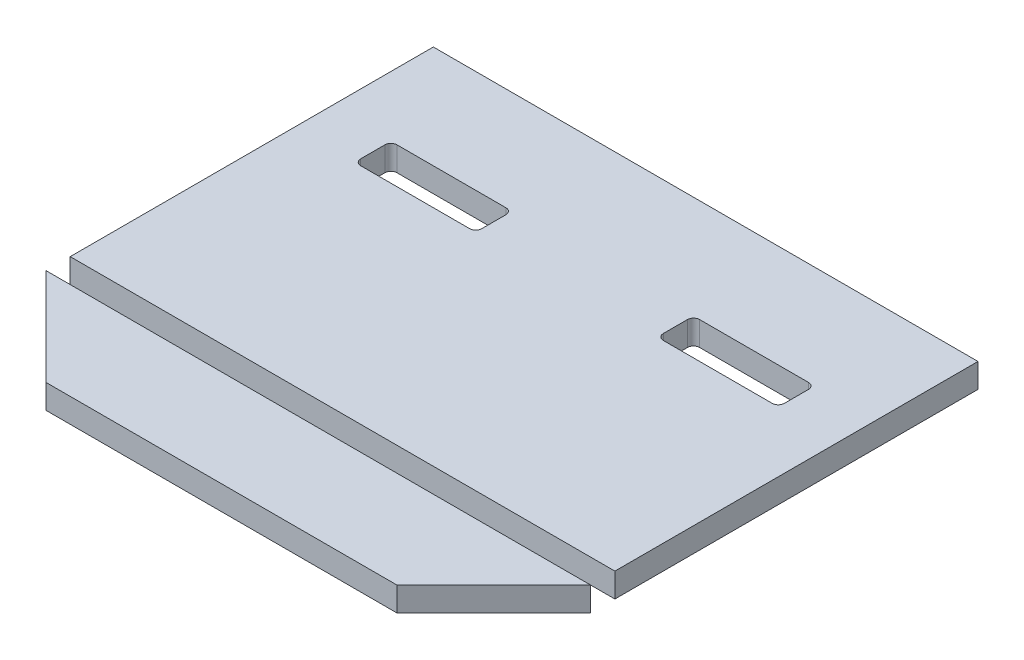
ISO-10303-21;
HEADER;
FILE_DESCRIPTION(('STEP AP214'),'2;1');
FILE_NAME('part.step','',(''),(''),'','','');
FILE_SCHEMA(('AUTOMOTIVE_DESIGN { 1 0 10303 214 1 1 1 1 }'));
ENDSEC;
DATA;
#1=APPLICATION_CONTEXT('core data for automotive mechanical design processes');
#2=APPLICATION_PROTOCOL_DEFINITION('international standard','automotive_design',2000,#1);
#3=PRODUCT_CONTEXT('',#1,'mechanical');
#4=PRODUCT('Part','Part','',(#3));
#5=PRODUCT_RELATED_PRODUCT_CATEGORY('part','',(#4));
#6=PRODUCT_DEFINITION_FORMATION('','',#4);
#7=PRODUCT_DEFINITION_CONTEXT('part definition',#1,'design');
#8=PRODUCT_DEFINITION('design','',#6,#7);
#9=PRODUCT_DEFINITION_SHAPE('','',#8);
#10=(LENGTH_UNIT() NAMED_UNIT(*) SI_UNIT(.MILLI.,.METRE.));
#11=(NAMED_UNIT(*) PLANE_ANGLE_UNIT() SI_UNIT($,.RADIAN.));
#12=(NAMED_UNIT(*) SI_UNIT($,.STERADIAN.) SOLID_ANGLE_UNIT());
#13=UNCERTAINTY_MEASURE_WITH_UNIT(LENGTH_MEASURE(1.E-05),#10,'distance_accuracy_value','');
#14=(GEOMETRIC_REPRESENTATION_CONTEXT(3) GLOBAL_UNCERTAINTY_ASSIGNED_CONTEXT((#13)) GLOBAL_UNIT_ASSIGNED_CONTEXT((#10,
#11,#12)) REPRESENTATION_CONTEXT('',''));
#15=CARTESIAN_POINT('',(0.,0.,0.));
#16=DIRECTION('',(0.,0.,1.));
#17=DIRECTION('',(1.,0.,0.));
#18=AXIS2_PLACEMENT_3D('',#15,#16,#17);
#19=CARTESIAN_POINT('',(19.75,2.,19.75));
#20=DIRECTION('',(0.707106781186548,0.,0.707106781186547));
#21=DIRECTION('',(0.707106781186547,0.,-0.707106781186548));
#22=AXIS2_PLACEMENT_3D('',#19,#20,#21);
#23=PLANE('',#22);
#24=DIRECTION('',(-0.707106781186547,0.,0.707106781186548));
#25=VECTOR('',#24,1.);
#26=CARTESIAN_POINT('',(19.75,0.,19.75));
#27=LINE('',#26,#25);
#28=CARTESIAN_POINT('',(22.5,0.,17.));
#29=VERTEX_POINT('',#28);
#30=CARTESIAN_POINT('',(14.5,0.,25.));
#31=VERTEX_POINT('',#30);
#32=EDGE_CURVE('E112',#29,#31,#27,.T.);
#33=ORIENTED_EDGE('',*,*,#32,.F.);
#34=DIRECTION('',(0.,-1.,0.));
#35=VECTOR('',#34,1.);
#36=CARTESIAN_POINT('',(22.5,2.,17.));
#37=LINE('',#36,#35);
#38=CARTESIAN_POINT('',(22.5,2.,17.));
#39=VERTEX_POINT('',#38);
#40=EDGE_CURVE('E12',#39,#29,#37,.T.);
#41=ORIENTED_EDGE('',*,*,#40,.F.);
#42=DIRECTION('',(-0.707106781186547,0.,0.707106781186548));
#43=VECTOR('',#42,1.);
#44=CARTESIAN_POINT('',(19.75,2.,19.75));
#45=LINE('',#44,#43);
#46=CARTESIAN_POINT('',(14.5,2.,25.));
#47=VERTEX_POINT('',#46);
#48=EDGE_CURVE('E106',#39,#47,#45,.T.);
#49=ORIENTED_EDGE('',*,*,#48,.T.);
#50=DIRECTION('',(0.,-1.,0.));
#51=VECTOR('',#50,1.);
#52=CARTESIAN_POINT('',(14.5,2.,25.));
#53=LINE('',#52,#51);
#54=EDGE_CURVE('E87',#47,#31,#53,.T.);
#55=ORIENTED_EDGE('',*,*,#54,.T.);
#56=EDGE_LOOP('',(#33,#41,#49,#55));
#57=FACE_BOUND('',#56,.T.);
#58=ADVANCED_FACE('F49',(#57),#23,.T.);
#59=CARTESIAN_POINT('',(0.,2.,17.));
#60=DIRECTION('',(0.,0.,-1.));
#61=DIRECTION('',(-1.,0.,0.));
#62=AXIS2_PLACEMENT_3D('',#59,#60,#61);
#63=PLANE('',#62);
#64=DIRECTION('',(1.,0.,0.));
#65=VECTOR('',#64,1.);
#66=CARTESIAN_POINT('',(0.,0.,17.));
#67=LINE('',#66,#65);
#68=CARTESIAN_POINT('',(-22.5,0.,17.));
#69=VERTEX_POINT('',#68);
#70=EDGE_CURVE('E100',#69,#29,#67,.T.);
#71=ORIENTED_EDGE('',*,*,#70,.F.);
#72=DIRECTION('',(0.,-1.,0.));
#73=VECTOR('',#72,1.);
#74=CARTESIAN_POINT('',(-22.5,2.,17.));
#75=LINE('',#74,#73);
#76=CARTESIAN_POINT('',(-22.5,2.,17.));
#77=VERTEX_POINT('',#76);
#78=EDGE_CURVE('E57',#77,#69,#75,.T.);
#79=ORIENTED_EDGE('',*,*,#78,.F.);
#80=DIRECTION('',(1.,0.,0.));
#81=VECTOR('',#80,1.);
#82=CARTESIAN_POINT('',(0.,2.,17.));
#83=LINE('',#82,#81);
#84=EDGE_CURVE('E98',#77,#39,#83,.T.);
#85=ORIENTED_EDGE('',*,*,#84,.T.);
#86=ORIENTED_EDGE('',*,*,#40,.T.);
#87=EDGE_LOOP('',(#71,#79,#85,#86));
#88=FACE_BOUND('',#87,.T.);
#89=ADVANCED_FACE('F96',(#88),#63,.T.);
#90=CARTESIAN_POINT('',(-19.75,2.,19.75));
#91=DIRECTION('',(0.707106781186547,0.,-0.707106781186547));
#92=DIRECTION('',(-0.707106781186548,0.,-0.707106781186548));
#93=AXIS2_PLACEMENT_3D('',#90,#91,#92);
#94=PLANE('',#93);
#95=DIRECTION('',(0.707106781186548,0.,0.707106781186548));
#96=VECTOR('',#95,1.);
#97=CARTESIAN_POINT('',(-19.75,0.,19.75));
#98=LINE('',#97,#96);
#99=CARTESIAN_POINT('',(-14.5,0.,25.));
#100=VERTEX_POINT('',#99);
#101=EDGE_CURVE('E80',#69,#100,#98,.T.);
#102=ORIENTED_EDGE('',*,*,#101,.T.);
#103=DIRECTION('',(0.,-1.,0.));
#104=VECTOR('',#103,1.);
#105=CARTESIAN_POINT('',(-14.5,2.,25.));
#106=LINE('',#105,#104);
#107=CARTESIAN_POINT('',(-14.5,2.,25.));
#108=VERTEX_POINT('',#107);
#109=EDGE_CURVE('E101',#108,#100,#106,.T.);
#110=ORIENTED_EDGE('',*,*,#109,.F.);
#111=DIRECTION('',(0.707106781186548,0.,0.707106781186548));
#112=VECTOR('',#111,1.);
#113=CARTESIAN_POINT('',(-19.75,2.,19.75));
#114=LINE('',#113,#112);
#115=EDGE_CURVE('E102',#77,#108,#114,.T.);
#116=ORIENTED_EDGE('',*,*,#115,.F.);
#117=ORIENTED_EDGE('',*,*,#78,.T.);
#118=EDGE_LOOP('',(#102,#110,#116,#117));
#119=FACE_BOUND('',#118,.T.);
#120=ADVANCED_FACE('F103',(#119),#94,.F.);
#121=CARTESIAN_POINT('',(0.,2.,25.));
#122=DIRECTION('',(0.,0.,-1.));
#123=DIRECTION('',(-1.,0.,0.));
#124=AXIS2_PLACEMENT_3D('',#121,#122,#123);
#125=PLANE('',#124);
#126=DIRECTION('',(1.,0.,0.));
#127=VECTOR('',#126,1.);
#128=CARTESIAN_POINT('',(0.,0.,25.));
#129=LINE('',#128,#127);
#130=EDGE_CURVE('E108',#100,#31,#129,.T.);
#131=ORIENTED_EDGE('',*,*,#130,.T.);
#132=ORIENTED_EDGE('',*,*,#54,.F.);
#133=DIRECTION('',(1.,0.,0.));
#134=VECTOR('',#133,1.);
#135=CARTESIAN_POINT('',(0.,2.,25.));
#136=LINE('',#135,#134);
#137=EDGE_CURVE('E65',#108,#47,#136,.T.);
#138=ORIENTED_EDGE('',*,*,#137,.F.);
#139=ORIENTED_EDGE('',*,*,#109,.T.);
#140=EDGE_LOOP('',(#131,#132,#138,#139));
#141=FACE_BOUND('',#140,.T.);
#142=ADVANCED_FACE('F121',(#141),#125,.F.);
#143=CARTESIAN_POINT('',(0.,2.,0.));
#144=DIRECTION('',(0.,1.,0.));
#145=DIRECTION('',(0.,0.,1.));
#146=AXIS2_PLACEMENT_3D('',#143,#144,#145);
#147=PLANE('',#146);
#148=ORIENTED_EDGE('',*,*,#48,.F.);
#149=ORIENTED_EDGE('',*,*,#84,.F.);
#150=ORIENTED_EDGE('',*,*,#115,.T.);
#151=ORIENTED_EDGE('',*,*,#137,.T.);
#152=EDGE_LOOP('',(#148,#149,#150,#151));
#153=FACE_BOUND('',#152,.T.);
#154=ADVANCED_FACE('F105',(#153),#147,.T.);
#155=CARTESIAN_POINT('',(0.,0.,0.));
#156=DIRECTION('',(0.,1.,0.));
#157=DIRECTION('',(0.,0.,1.));
#158=AXIS2_PLACEMENT_3D('',#155,#156,#157);
#159=PLANE('',#158);
#160=ORIENTED_EDGE('',*,*,#32,.T.);
#161=ORIENTED_EDGE('',*,*,#130,.F.);
#162=ORIENTED_EDGE('',*,*,#101,.F.);
#163=ORIENTED_EDGE('',*,*,#70,.T.);
#164=EDGE_LOOP('',(#160,#161,#162,#163));
#165=FACE_BOUND('',#164,.T.);
#166=ADVANCED_FACE('F123',(#165),#159,.F.);
#167=CLOSED_SHELL('',(#58,#89,#120,#142,#154,#166));
#168=MANIFOLD_SOLID_BREP('B2',#167);
#169=CARTESIAN_POINT('',(7.50000000000001,2.,0.));
#170=DIRECTION('',(1.,0.,0.));
#171=DIRECTION('',(0.,0.,-1.));
#172=AXIS2_PLACEMENT_3D('',#169,#170,#171);
#173=PLANE('',#172);
#174=DIRECTION('',(0.,0.,1.));
#175=VECTOR('',#174,1.);
#176=CARTESIAN_POINT('',(7.50000000000001,0.,0.));
#177=LINE('',#176,#175);
#178=CARTESIAN_POINT('',(7.50000000000001,0.,-5.99818763102563));
#179=VERTEX_POINT('',#178);
#180=CARTESIAN_POINT('',(7.50000000000001,0.,-4.00181236897437));
#181=VERTEX_POINT('',#180);
#182=EDGE_CURVE('E457',#179,#181,#177,.T.);
#183=ORIENTED_EDGE('',*,*,#182,.F.);
#184=DIRECTION('',(0.,-1.,0.));
#185=VECTOR('',#184,1.);
#186=CARTESIAN_POINT('',(7.50000000000001,2.,-5.99818763102563));
#187=LINE('',#186,#185);
#188=CARTESIAN_POINT('',(7.50000000000001,2.,-5.99818763102563));
#189=VERTEX_POINT('',#188);
#190=EDGE_CURVE('E47',#189,#179,#187,.T.);
#191=ORIENTED_EDGE('',*,*,#190,.F.);
#192=DIRECTION('',(0.,0.,1.));
#193=VECTOR('',#192,1.);
#194=CARTESIAN_POINT('',(7.50000000000001,2.,0.));
#195=LINE('',#194,#193);
#196=CARTESIAN_POINT('',(7.50000000000001,2.,-4.00181236897437));
#197=VERTEX_POINT('',#196);
#198=EDGE_CURVE('E528',#189,#197,#195,.T.);
#199=ORIENTED_EDGE('',*,*,#198,.T.);
#200=DIRECTION('',(0.,-1.,0.));
#201=VECTOR('',#200,1.);
#202=CARTESIAN_POINT('',(7.50000000000001,2.,-4.00181236897437));
#203=LINE('',#202,#201);
#204=EDGE_CURVE('E193',#197,#181,#203,.T.);
#205=ORIENTED_EDGE('',*,*,#204,.T.);
#206=EDGE_LOOP('',(#183,#191,#199,#205));
#207=FACE_BOUND('',#206,.T.);
#208=ADVANCED_FACE('F173',(#207),#173,.T.);
#209=CARTESIAN_POINT('',(8.00000000000001,2.,-5.99818763102563));
#210=DIRECTION('',(0.,-1.,0.));
#211=DIRECTION('',(0.,0.,-1.));
#212=AXIS2_PLACEMENT_3D('',#209,#210,#211);
#213=CYLINDRICAL_SURFACE('',#212,0.5);
#214=CARTESIAN_POINT('',(8.00000000000001,0.,-5.99818763102563));
#215=DIRECTION('',(0.,1.,0.));
#216=DIRECTION('',(0.,0.,1.));
#217=AXIS2_PLACEMENT_3D('',#214,#215,#216);
#218=CIRCLE('',#217,0.5);
#219=CARTESIAN_POINT('',(8.00000000000001,0.,-6.49818763102563));
#220=VERTEX_POINT('',#219);
#221=EDGE_CURVE('E460',#179,#220,#218,.F.);
#222=ORIENTED_EDGE('',*,*,#221,.T.);
#223=DIRECTION('',(0.,-1.,0.));
#224=VECTOR('',#223,1.);
#225=CARTESIAN_POINT('',(8.00000000000001,2.,-6.49818763102563));
#226=LINE('',#225,#224);
#227=CARTESIAN_POINT('',(8.00000000000001,2.,-6.49818763102563));
#228=VERTEX_POINT('',#227);
#229=EDGE_CURVE('E184',#228,#220,#226,.T.);
#230=ORIENTED_EDGE('',*,*,#229,.F.);
#231=CARTESIAN_POINT('',(8.00000000000001,2.,-5.99818763102563));
#232=DIRECTION('',(0.,1.,0.));
#233=DIRECTION('',(0.,0.,1.));
#234=AXIS2_PLACEMENT_3D('',#231,#232,#233);
#235=CIRCLE('',#234,0.5);
#236=EDGE_CURVE('E531',#189,#228,#235,.F.);
#237=ORIENTED_EDGE('',*,*,#236,.F.);
#238=ORIENTED_EDGE('',*,*,#190,.T.);
#239=EDGE_LOOP('',(#222,#230,#237,#238));
#240=FACE_BOUND('',#239,.T.);
#241=ADVANCED_FACE('F550',(#240),#213,.F.);
#242=CARTESIAN_POINT('',(0.,2.,-6.49818763102563));
#243=DIRECTION('',(0.,0.,1.));
#244=DIRECTION('',(1.,0.,0.));
#245=AXIS2_PLACEMENT_3D('',#242,#243,#244);
#246=PLANE('',#245);
#247=DIRECTION('',(-1.,0.,0.));
#248=VECTOR('',#247,1.);
#249=CARTESIAN_POINT('',(0.,0.,-6.49818763102563));
#250=LINE('',#249,#248);
#251=CARTESIAN_POINT('',(17.,0.,-6.49818763102563));
#252=VERTEX_POINT('',#251);
#253=EDGE_CURVE('E464',#252,#220,#250,.T.);
#254=ORIENTED_EDGE('',*,*,#253,.F.);
#255=DIRECTION('',(0.,-1.,0.));
#256=VECTOR('',#255,1.);
#257=CARTESIAN_POINT('',(17.,2.,-6.49818763102563));
#258=LINE('',#257,#256);
#259=CARTESIAN_POINT('',(17.,2.,-6.49818763102563));
#260=VERTEX_POINT('',#259);
#261=EDGE_CURVE('E355',#260,#252,#258,.T.);
#262=ORIENTED_EDGE('',*,*,#261,.F.);
#263=DIRECTION('',(-1.,0.,0.));
#264=VECTOR('',#263,1.);
#265=CARTESIAN_POINT('',(0.,2.,-6.49818763102563));
#266=LINE('',#265,#264);
#267=EDGE_CURVE('E534',#260,#228,#266,.T.);
#268=ORIENTED_EDGE('',*,*,#267,.T.);
#269=ORIENTED_EDGE('',*,*,#229,.T.);
#270=EDGE_LOOP('',(#254,#262,#268,#269));
#271=FACE_BOUND('',#270,.T.);
#272=ADVANCED_FACE('F553',(#271),#246,.T.);
#273=CARTESIAN_POINT('',(17.,2.,-5.99818763102563));
#274=DIRECTION('',(0.,-1.,0.));
#275=DIRECTION('',(0.,0.,-1.));
#276=AXIS2_PLACEMENT_3D('',#273,#274,#275);
#277=CYLINDRICAL_SURFACE('',#276,0.5);
#278=CARTESIAN_POINT('',(17.,0.,-5.99818763102563));
#279=DIRECTION('',(0.,1.,0.));
#280=DIRECTION('',(0.,0.,1.));
#281=AXIS2_PLACEMENT_3D('',#278,#279,#280);
#282=CIRCLE('',#281,0.5);
#283=CARTESIAN_POINT('',(17.5,0.,-5.99818763102563));
#284=VERTEX_POINT('',#283);
#285=EDGE_CURVE('E468',#284,#252,#282,.T.);
#286=ORIENTED_EDGE('',*,*,#285,.F.);
#287=DIRECTION('',(0.,-1.,0.));
#288=VECTOR('',#287,1.);
#289=CARTESIAN_POINT('',(17.5,2.,-5.99818763102563));
#290=LINE('',#289,#288);
#291=CARTESIAN_POINT('',(17.5,2.,-5.99818763102563));
#292=VERTEX_POINT('',#291);
#293=EDGE_CURVE('E348',#292,#284,#290,.T.);
#294=ORIENTED_EDGE('',*,*,#293,.F.);
#295=CARTESIAN_POINT('',(17.,2.,-5.99818763102563));
#296=DIRECTION('',(0.,1.,0.));
#297=DIRECTION('',(0.,0.,1.));
#298=AXIS2_PLACEMENT_3D('',#295,#296,#297);
#299=CIRCLE('',#298,0.5);
#300=EDGE_CURVE('E538',#292,#260,#299,.T.);
#301=ORIENTED_EDGE('',*,*,#300,.T.);
#302=ORIENTED_EDGE('',*,*,#261,.T.);
#303=EDGE_LOOP('',(#286,#294,#301,#302));
#304=FACE_BOUND('',#303,.T.);
#305=ADVANCED_FACE('F556',(#304),#277,.F.);
#306=CARTESIAN_POINT('',(17.5,2.,0.));
#307=DIRECTION('',(1.,0.,0.));
#308=DIRECTION('',(0.,0.,-1.));
#309=AXIS2_PLACEMENT_3D('',#306,#307,#308);
#310=PLANE('',#309);
#311=DIRECTION('',(0.,0.,1.));
#312=VECTOR('',#311,1.);
#313=CARTESIAN_POINT('',(17.5,0.,0.));
#314=LINE('',#313,#312);
#315=CARTESIAN_POINT('',(17.5,0.,-4.00181236897437));
#316=VERTEX_POINT('',#315);
#317=EDGE_CURVE('E472',#284,#316,#314,.T.);
#318=ORIENTED_EDGE('',*,*,#317,.T.);
#319=DIRECTION('',(0.,-1.,0.));
#320=VECTOR('',#319,1.);
#321=CARTESIAN_POINT('',(17.5,2.,-4.00181236897437));
#322=LINE('',#321,#320);
#323=CARTESIAN_POINT('',(17.5,2.,-4.00181236897437));
#324=VERTEX_POINT('',#323);
#325=EDGE_CURVE('E344',#324,#316,#322,.T.);
#326=ORIENTED_EDGE('',*,*,#325,.F.);
#327=DIRECTION('',(0.,0.,1.));
#328=VECTOR('',#327,1.);
#329=CARTESIAN_POINT('',(17.5,2.,0.));
#330=LINE('',#329,#328);
#331=EDGE_CURVE('E335',#292,#324,#330,.T.);
#332=ORIENTED_EDGE('',*,*,#331,.F.);
#333=ORIENTED_EDGE('',*,*,#293,.T.);
#334=EDGE_LOOP('',(#318,#326,#332,#333));
#335=FACE_BOUND('',#334,.T.);
#336=ADVANCED_FACE('F559',(#335),#310,.F.);
#337=CARTESIAN_POINT('',(17.,2.,-4.00181236897437));
#338=DIRECTION('',(0.,-1.,0.));
#339=DIRECTION('',(0.,0.,-1.));
#340=AXIS2_PLACEMENT_3D('',#337,#338,#339);
#341=CYLINDRICAL_SURFACE('',#340,0.5);
#342=CARTESIAN_POINT('',(17.,0.,-4.00181236897437));
#343=DIRECTION('',(0.,1.,0.));
#344=DIRECTION('',(0.,0.,1.));
#345=AXIS2_PLACEMENT_3D('',#342,#343,#344);
#346=CIRCLE('',#345,0.5);
#347=CARTESIAN_POINT('',(17.,0.,-3.50181236897437));
#348=VERTEX_POINT('',#347);
#349=EDGE_CURVE('E342',#316,#348,#346,.F.);
#350=ORIENTED_EDGE('',*,*,#349,.T.);
#351=DIRECTION('',(0.,-1.,0.));
#352=VECTOR('',#351,1.);
#353=CARTESIAN_POINT('',(17.,2.,-3.50181236897437));
#354=LINE('',#353,#352);
#355=CARTESIAN_POINT('',(17.,2.,-3.50181236897437));
#356=VERTEX_POINT('',#355);
#357=EDGE_CURVE('E322',#356,#348,#354,.T.);
#358=ORIENTED_EDGE('',*,*,#357,.F.);
#359=CARTESIAN_POINT('',(17.,2.,-4.00181236897437));
#360=DIRECTION('',(0.,1.,0.));
#361=DIRECTION('',(0.,0.,1.));
#362=AXIS2_PLACEMENT_3D('',#359,#360,#361);
#363=CIRCLE('',#362,0.5);
#364=EDGE_CURVE('E328',#324,#356,#363,.F.);
#365=ORIENTED_EDGE('',*,*,#364,.F.);
#366=ORIENTED_EDGE('',*,*,#325,.T.);
#367=EDGE_LOOP('',(#350,#358,#365,#366));
#368=FACE_BOUND('',#367,.T.);
#369=ADVANCED_FACE('F341',(#368),#341,.F.);
#370=CARTESIAN_POINT('',(0.,2.,-3.50181236897437));
#371=DIRECTION('',(0.,0.,1.));
#372=DIRECTION('',(1.,0.,0.));
#373=AXIS2_PLACEMENT_3D('',#370,#371,#372);
#374=PLANE('',#373);
#375=DIRECTION('',(-1.,0.,0.));
#376=VECTOR('',#375,1.);
#377=CARTESIAN_POINT('',(0.,0.,-3.50181236897437));
#378=LINE('',#377,#376);
#379=CARTESIAN_POINT('',(8.00000000000001,0.,-3.50181236897437));
#380=VERTEX_POINT('',#379);
#381=EDGE_CURVE('E478',#348,#380,#378,.T.);
#382=ORIENTED_EDGE('',*,*,#381,.T.);
#383=DIRECTION('',(0.,-1.,0.));
#384=VECTOR('',#383,1.);
#385=CARTESIAN_POINT('',(8.00000000000001,2.,-3.50181236897437));
#386=LINE('',#385,#384);
#387=CARTESIAN_POINT('',(8.00000000000001,2.,-3.50181236897437));
#388=VERTEX_POINT('',#387);
#389=EDGE_CURVE('E255',#388,#380,#386,.T.);
#390=ORIENTED_EDGE('',*,*,#389,.F.);
#391=DIRECTION('',(-1.,0.,0.));
#392=VECTOR('',#391,1.);
#393=CARTESIAN_POINT('',(0.,2.,-3.50181236897437));
#394=LINE('',#393,#392);
#395=EDGE_CURVE('E318',#356,#388,#394,.T.);
#396=ORIENTED_EDGE('',*,*,#395,.F.);
#397=ORIENTED_EDGE('',*,*,#357,.T.);
#398=EDGE_LOOP('',(#382,#390,#396,#397));
#399=FACE_BOUND('',#398,.T.);
#400=ADVANCED_FACE('F320',(#399),#374,.F.);
#401=CARTESIAN_POINT('',(0.,2.,-15.));
#402=DIRECTION('',(0.,0.,1.));
#403=DIRECTION('',(1.,0.,0.));
#404=AXIS2_PLACEMENT_3D('',#401,#402,#403);
#405=PLANE('',#404);
#406=DIRECTION('',(-1.,0.,0.));
#407=VECTOR('',#406,1.);
#408=CARTESIAN_POINT('',(0.,0.,-15.));
#409=LINE('',#408,#407);
#410=CARTESIAN_POINT('',(22.5,0.,-15.));
#411=VERTEX_POINT('',#410);
#412=CARTESIAN_POINT('',(-22.5,0.,-15.));
#413=VERTEX_POINT('',#412);
#414=EDGE_CURVE('E441',#411,#413,#409,.T.);
#415=ORIENTED_EDGE('',*,*,#414,.T.);
#416=DIRECTION('',(0.,-1.,0.));
#417=VECTOR('',#416,1.);
#418=CARTESIAN_POINT('',(-22.5,2.,-15.));
#419=LINE('',#418,#417);
#420=CARTESIAN_POINT('',(-22.5,2.,-15.));
#421=VERTEX_POINT('',#420);
#422=EDGE_CURVE('E369',#421,#413,#419,.T.);
#423=ORIENTED_EDGE('',*,*,#422,.F.);
#424=DIRECTION('',(-1.,0.,0.));
#425=VECTOR('',#424,1.);
#426=CARTESIAN_POINT('',(0.,2.,-15.));
#427=LINE('',#426,#425);
#428=CARTESIAN_POINT('',(22.5,2.,-15.));
#429=VERTEX_POINT('',#428);
#430=EDGE_CURVE('E513',#429,#421,#427,.T.);
#431=ORIENTED_EDGE('',*,*,#430,.F.);
#432=DIRECTION('',(0.,-1.,0.));
#433=VECTOR('',#432,1.);
#434=CARTESIAN_POINT('',(22.5,2.,-15.));
#435=LINE('',#434,#433);
#436=EDGE_CURVE('E360',#429,#411,#435,.T.);
#437=ORIENTED_EDGE('',*,*,#436,.T.);
#438=EDGE_LOOP('',(#415,#423,#431,#437));
#439=FACE_BOUND('',#438,.T.);
#440=ADVANCED_FACE('F589',(#439),#405,.F.);
#441=CARTESIAN_POINT('',(-22.5,2.,0.));
#442=DIRECTION('',(1.,0.,0.));
#443=DIRECTION('',(0.,0.,-1.));
#444=AXIS2_PLACEMENT_3D('',#441,#442,#443);
#445=PLANE('',#444);
#446=DIRECTION('',(0.,0.,1.));
#447=VECTOR('',#446,1.);
#448=CARTESIAN_POINT('',(-22.5,0.,0.));
#449=LINE('',#448,#447);
#450=CARTESIAN_POINT('',(-22.5,0.,15.));
#451=VERTEX_POINT('',#450);
#452=EDGE_CURVE('E445',#413,#451,#449,.T.);
#453=ORIENTED_EDGE('',*,*,#452,.T.);
#454=DIRECTION('',(0.,-1.,0.));
#455=VECTOR('',#454,1.);
#456=CARTESIAN_POINT('',(-22.5,2.,15.));
#457=LINE('',#456,#455);
#458=CARTESIAN_POINT('',(-22.5,2.,15.));
#459=VERTEX_POINT('',#458);
#460=EDGE_CURVE('E366',#459,#451,#457,.T.);
#461=ORIENTED_EDGE('',*,*,#460,.F.);
#462=DIRECTION('',(0.,0.,1.));
#463=VECTOR('',#462,1.);
#464=CARTESIAN_POINT('',(-22.5,2.,0.));
#465=LINE('',#464,#463);
#466=EDGE_CURVE('E517',#421,#459,#465,.T.);
#467=ORIENTED_EDGE('',*,*,#466,.F.);
#468=ORIENTED_EDGE('',*,*,#422,.T.);
#469=EDGE_LOOP('',(#453,#461,#467,#468));
#470=FACE_BOUND('',#469,.T.);
#471=ADVANCED_FACE('F585',(#470),#445,.F.);
#472=CARTESIAN_POINT('',(0.,2.,15.));
#473=DIRECTION('',(0.,0.,1.));
#474=DIRECTION('',(1.,0.,0.));
#475=AXIS2_PLACEMENT_3D('',#472,#473,#474);
#476=PLANE('',#475);
#477=DIRECTION('',(-1.,0.,0.));
#478=VECTOR('',#477,1.);
#479=CARTESIAN_POINT('',(0.,0.,15.));
#480=LINE('',#479,#478);
#481=CARTESIAN_POINT('',(22.5,0.,15.));
#482=VERTEX_POINT('',#481);
#483=EDGE_CURVE('E449',#482,#451,#480,.T.);
#484=ORIENTED_EDGE('',*,*,#483,.F.);
#485=DIRECTION('',(0.,-1.,0.));
#486=VECTOR('',#485,1.);
#487=CARTESIAN_POINT('',(22.5,2.,15.));
#488=LINE('',#487,#486);
#489=CARTESIAN_POINT('',(22.5,2.,15.));
#490=VERTEX_POINT('',#489);
#491=EDGE_CURVE('E363',#490,#482,#488,.T.);
#492=ORIENTED_EDGE('',*,*,#491,.F.);
#493=DIRECTION('',(-1.,0.,0.));
#494=VECTOR('',#493,1.);
#495=CARTESIAN_POINT('',(0.,2.,15.));
#496=LINE('',#495,#494);
#497=EDGE_CURVE('E520',#490,#459,#496,.T.);
#498=ORIENTED_EDGE('',*,*,#497,.T.);
#499=ORIENTED_EDGE('',*,*,#460,.T.);
#500=EDGE_LOOP('',(#484,#492,#498,#499));
#501=FACE_BOUND('',#500,.T.);
#502=ADVANCED_FACE('F582',(#501),#476,.T.);
#503=CARTESIAN_POINT('',(-8.,2.,-5.99818763102563));
#504=DIRECTION('',(0.,-1.,0.));
#505=DIRECTION('',(0.,0.,-1.));
#506=AXIS2_PLACEMENT_3D('',#503,#504,#505);
#507=CYLINDRICAL_SURFACE('',#506,0.5);
#508=CARTESIAN_POINT('',(-8.,0.,-5.99818763102563));
#509=DIRECTION('',(0.,1.,0.));
#510=DIRECTION('',(0.,0.,1.));
#511=AXIS2_PLACEMENT_3D('',#508,#509,#510);
#512=CIRCLE('',#511,0.5);
#513=CARTESIAN_POINT('',(-7.5,0.,-5.99818763102563));
#514=VERTEX_POINT('',#513);
#515=CARTESIAN_POINT('',(-8.,0.,-6.49818763102563));
#516=VERTEX_POINT('',#515);
#517=EDGE_CURVE('E411',#514,#516,#512,.T.);
#518=ORIENTED_EDGE('',*,*,#517,.F.);
#519=DIRECTION('',(0.,-1.,0.));
#520=VECTOR('',#519,1.);
#521=CARTESIAN_POINT('',(-7.5,2.,-5.99818763102563));
#522=LINE('',#521,#520);
#523=CARTESIAN_POINT('',(-7.5,2.,-5.99818763102563));
#524=VERTEX_POINT('',#523);
#525=EDGE_CURVE('E177',#524,#514,#522,.T.);
#526=ORIENTED_EDGE('',*,*,#525,.F.);
#527=CARTESIAN_POINT('',(-8.,2.,-5.99818763102563));
#528=DIRECTION('',(0.,1.,0.));
#529=DIRECTION('',(0.,0.,1.));
#530=AXIS2_PLACEMENT_3D('',#527,#528,#529);
#531=CIRCLE('',#530,0.5);
#532=CARTESIAN_POINT('',(-8.,2.,-6.49818763102563));
#533=VERTEX_POINT('',#532);
#534=EDGE_CURVE('E484',#524,#533,#531,.T.);
#535=ORIENTED_EDGE('',*,*,#534,.T.);
#536=DIRECTION('',(0.,-1.,0.));
#537=VECTOR('',#536,1.);
#538=CARTESIAN_POINT('',(-8.,2.,-6.49818763102563));
#539=LINE('',#538,#537);
#540=EDGE_CURVE('E373',#533,#516,#539,.T.);
#541=ORIENTED_EDGE('',*,*,#540,.T.);
#542=EDGE_LOOP('',(#518,#526,#535,#541));
#543=FACE_BOUND('',#542,.T.);
#544=ADVANCED_FACE('F175',(#543),#507,.F.);
#545=CARTESIAN_POINT('',(-7.5,2.,0.));
#546=DIRECTION('',(1.,0.,0.));
#547=DIRECTION('',(0.,0.,-1.));
#548=AXIS2_PLACEMENT_3D('',#545,#546,#547);
#549=PLANE('',#548);
#550=DIRECTION('',(0.,0.,1.));
#551=VECTOR('',#550,1.);
#552=CARTESIAN_POINT('',(-7.5,0.,0.));
#553=LINE('',#552,#551);
#554=CARTESIAN_POINT('',(-7.5,0.,-4.00181236897437));
#555=VERTEX_POINT('',#554);
#556=EDGE_CURVE('E403',#514,#555,#553,.T.);
#557=ORIENTED_EDGE('',*,*,#556,.T.);
#558=DIRECTION('',(0.,-1.,0.));
#559=VECTOR('',#558,1.);
#560=CARTESIAN_POINT('',(-7.5,2.,-4.00181236897437));
#561=LINE('',#560,#559);
#562=CARTESIAN_POINT('',(-7.5,2.,-4.00181236897437));
#563=VERTEX_POINT('',#562);
#564=EDGE_CURVE('E391',#563,#555,#561,.T.);
#565=ORIENTED_EDGE('',*,*,#564,.F.);
#566=DIRECTION('',(0.,0.,1.));
#567=VECTOR('',#566,1.);
#568=CARTESIAN_POINT('',(-7.5,2.,0.));
#569=LINE('',#568,#567);
#570=EDGE_CURVE('E404',#524,#563,#569,.T.);
#571=ORIENTED_EDGE('',*,*,#570,.F.);
#572=ORIENTED_EDGE('',*,*,#525,.T.);
#573=EDGE_LOOP('',(#557,#565,#571,#572));
#574=FACE_BOUND('',#573,.T.);
#575=ADVANCED_FACE('F402',(#574),#549,.F.);
#576=CARTESIAN_POINT('',(-8.,2.,-4.00181236897437));
#577=DIRECTION('',(0.,-1.,0.));
#578=DIRECTION('',(0.,0.,-1.));
#579=AXIS2_PLACEMENT_3D('',#576,#577,#578);
#580=CYLINDRICAL_SURFACE('',#579,0.5);
#581=CARTESIAN_POINT('',(-8.,0.,-4.00181236897437));
#582=DIRECTION('',(0.,1.,0.));
#583=DIRECTION('',(0.,0.,1.));
#584=AXIS2_PLACEMENT_3D('',#581,#582,#583);
#585=CIRCLE('',#584,0.5);
#586=CARTESIAN_POINT('',(-8.,0.,-3.50181236897437));
#587=VERTEX_POINT('',#586);
#588=EDGE_CURVE('E413',#555,#587,#585,.F.);
#589=ORIENTED_EDGE('',*,*,#588,.T.);
#590=DIRECTION('',(0.,-1.,0.));
#591=VECTOR('',#590,1.);
#592=CARTESIAN_POINT('',(-8.,2.,-3.50181236897437));
#593=LINE('',#592,#591);
#594=CARTESIAN_POINT('',(-8.,2.,-3.50181236897437));
#595=VERTEX_POINT('',#594);
#596=EDGE_CURVE('E389',#595,#587,#593,.T.);
#597=ORIENTED_EDGE('',*,*,#596,.F.);
#598=CARTESIAN_POINT('',(-8.,2.,-4.00181236897437));
#599=DIRECTION('',(0.,1.,0.));
#600=DIRECTION('',(0.,0.,1.));
#601=AXIS2_PLACEMENT_3D('',#598,#599,#600);
#602=CIRCLE('',#601,0.5);
#603=EDGE_CURVE('E490',#563,#595,#602,.F.);
#604=ORIENTED_EDGE('',*,*,#603,.F.);
#605=ORIENTED_EDGE('',*,*,#564,.T.);
#606=EDGE_LOOP('',(#589,#597,#604,#605));
#607=FACE_BOUND('',#606,.T.);
#608=ADVANCED_FACE('F611',(#607),#580,.F.);
#609=CARTESIAN_POINT('',(0.,2.,-3.50181236897437));
#610=DIRECTION('',(0.,0.,-1.));
#611=DIRECTION('',(-1.,0.,0.));
#612=AXIS2_PLACEMENT_3D('',#609,#610,#611);
#613=PLANE('',#612);
#614=DIRECTION('',(1.,0.,0.));
#615=VECTOR('',#614,1.);
#616=CARTESIAN_POINT('',(0.,0.,-3.50181236897437));
#617=LINE('',#616,#615);
#618=CARTESIAN_POINT('',(-17.,0.,-3.50181236897437));
#619=VERTEX_POINT('',#618);
#620=EDGE_CURVE('E424',#619,#587,#617,.T.);
#621=ORIENTED_EDGE('',*,*,#620,.F.);
#622=DIRECTION('',(0.,-1.,0.));
#623=VECTOR('',#622,1.);
#624=CARTESIAN_POINT('',(-17.,2.,-3.50181236897437));
#625=LINE('',#624,#623);
#626=CARTESIAN_POINT('',(-17.,2.,-3.50181236897437));
#627=VERTEX_POINT('',#626);
#628=EDGE_CURVE('E386',#627,#619,#625,.T.);
#629=ORIENTED_EDGE('',*,*,#628,.F.);
#630=DIRECTION('',(1.,0.,0.));
#631=VECTOR('',#630,1.);
#632=CARTESIAN_POINT('',(0.,2.,-3.50181236897437));
#633=LINE('',#632,#631);
#634=EDGE_CURVE('E495',#627,#595,#633,.T.);
#635=ORIENTED_EDGE('',*,*,#634,.T.);
#636=ORIENTED_EDGE('',*,*,#596,.T.);
#637=EDGE_LOOP('',(#621,#629,#635,#636));
#638=FACE_BOUND('',#637,.T.);
#639=ADVANCED_FACE('F607',(#638),#613,.T.);
#640=CARTESIAN_POINT('',(-17.,2.,-4.00181236897437));
#641=DIRECTION('',(0.,-1.,0.));
#642=DIRECTION('',(0.,0.,-1.));
#643=AXIS2_PLACEMENT_3D('',#640,#641,#642);
#644=CYLINDRICAL_SURFACE('',#643,0.5);
#645=CARTESIAN_POINT('',(-17.,0.,-4.00181236897437));
#646=DIRECTION('',(0.,1.,0.));
#647=DIRECTION('',(0.,0.,1.));
#648=AXIS2_PLACEMENT_3D('',#645,#646,#647);
#649=CIRCLE('',#648,0.5);
#650=CARTESIAN_POINT('',(-17.5,0.,-4.00181236897437));
#651=VERTEX_POINT('',#650);
#652=EDGE_CURVE('E427',#651,#619,#649,.T.);
#653=ORIENTED_EDGE('',*,*,#652,.F.);
#654=DIRECTION('',(0.,-1.,0.));
#655=VECTOR('',#654,1.);
#656=CARTESIAN_POINT('',(-17.5,2.,-4.00181236897437));
#657=LINE('',#656,#655);
#658=CARTESIAN_POINT('',(-17.5,2.,-4.00181236897437));
#659=VERTEX_POINT('',#658);
#660=EDGE_CURVE('E383',#659,#651,#657,.T.);
#661=ORIENTED_EDGE('',*,*,#660,.F.);
#662=CARTESIAN_POINT('',(-17.,2.,-4.00181236897437));
#663=DIRECTION('',(0.,1.,0.));
#664=DIRECTION('',(0.,0.,1.));
#665=AXIS2_PLACEMENT_3D('',#662,#663,#664);
#666=CIRCLE('',#665,0.5);
#667=EDGE_CURVE('E499',#659,#627,#666,.T.);
#668=ORIENTED_EDGE('',*,*,#667,.T.);
#669=ORIENTED_EDGE('',*,*,#628,.T.);
#670=EDGE_LOOP('',(#653,#661,#668,#669));
#671=FACE_BOUND('',#670,.T.);
#672=ADVANCED_FACE('F603',(#671),#644,.F.);
#673=CARTESIAN_POINT('',(-17.5,2.,0.));
#674=DIRECTION('',(1.,0.,0.));
#675=DIRECTION('',(0.,0.,-1.));
#676=AXIS2_PLACEMENT_3D('',#673,#674,#675);
#677=PLANE('',#676);
#678=DIRECTION('',(0.,0.,1.));
#679=VECTOR('',#678,1.);
#680=CARTESIAN_POINT('',(-17.5,0.,0.));
#681=LINE('',#680,#679);
#682=CARTESIAN_POINT('',(-17.5,0.,-5.99818763102563));
#683=VERTEX_POINT('',#682);
#684=EDGE_CURVE('E431',#683,#651,#681,.T.);
#685=ORIENTED_EDGE('',*,*,#684,.F.);
#686=DIRECTION('',(0.,-1.,0.));
#687=VECTOR('',#686,1.);
#688=CARTESIAN_POINT('',(-17.5,2.,-5.99818763102563));
#689=LINE('',#688,#687);
#690=CARTESIAN_POINT('',(-17.5,2.,-5.99818763102563));
#691=VERTEX_POINT('',#690);
#692=EDGE_CURVE('E380',#691,#683,#689,.T.);
#693=ORIENTED_EDGE('',*,*,#692,.F.);
#694=DIRECTION('',(0.,0.,1.));
#695=VECTOR('',#694,1.);
#696=CARTESIAN_POINT('',(-17.5,2.,0.));
#697=LINE('',#696,#695);
#698=EDGE_CURVE('E503',#691,#659,#697,.T.);
#699=ORIENTED_EDGE('',*,*,#698,.T.);
#700=ORIENTED_EDGE('',*,*,#660,.T.);
#701=EDGE_LOOP('',(#685,#693,#699,#700));
#702=FACE_BOUND('',#701,.T.);
#703=ADVANCED_FACE('F599',(#702),#677,.T.);
#704=CARTESIAN_POINT('',(-17.,2.,-5.99818763102563));
#705=DIRECTION('',(0.,-1.,0.));
#706=DIRECTION('',(0.,0.,-1.));
#707=AXIS2_PLACEMENT_3D('',#704,#705,#706);
#708=CYLINDRICAL_SURFACE('',#707,0.5);
#709=CARTESIAN_POINT('',(-17.,0.,-5.99818763102563));
#710=DIRECTION('',(0.,1.,0.));
#711=DIRECTION('',(0.,0.,1.));
#712=AXIS2_PLACEMENT_3D('',#709,#710,#711);
#713=CIRCLE('',#712,0.5);
#714=CARTESIAN_POINT('',(-17.,0.,-6.49818763102563));
#715=VERTEX_POINT('',#714);
#716=EDGE_CURVE('E435',#683,#715,#713,.F.);
#717=ORIENTED_EDGE('',*,*,#716,.T.);
#718=DIRECTION('',(0.,-1.,0.));
#719=VECTOR('',#718,1.);
#720=CARTESIAN_POINT('',(-17.,2.,-6.49818763102563));
#721=LINE('',#720,#719);
#722=CARTESIAN_POINT('',(-17.,2.,-6.49818763102563));
#723=VERTEX_POINT('',#722);
#724=EDGE_CURVE('E376',#723,#715,#721,.T.);
#725=ORIENTED_EDGE('',*,*,#724,.F.);
#726=CARTESIAN_POINT('',(-17.,2.,-5.99818763102563));
#727=DIRECTION('',(0.,1.,0.));
#728=DIRECTION('',(0.,0.,1.));
#729=AXIS2_PLACEMENT_3D('',#726,#727,#728);
#730=CIRCLE('',#729,0.5);
#731=EDGE_CURVE('E507',#691,#723,#730,.F.);
#732=ORIENTED_EDGE('',*,*,#731,.F.);
#733=ORIENTED_EDGE('',*,*,#692,.T.);
#734=EDGE_LOOP('',(#717,#725,#732,#733));
#735=FACE_BOUND('',#734,.T.);
#736=ADVANCED_FACE('F580',(#735),#708,.F.);
#737=CARTESIAN_POINT('',(22.5,2.,0.));
#738=DIRECTION('',(1.,0.,0.));
#739=DIRECTION('',(0.,0.,-1.));
#740=AXIS2_PLACEMENT_3D('',#737,#738,#739);
#741=PLANE('',#740);
#742=DIRECTION('',(0.,0.,1.));
#743=VECTOR('',#742,1.);
#744=CARTESIAN_POINT('',(22.5,0.,0.));
#745=LINE('',#744,#743);
#746=EDGE_CURVE('E453',#411,#482,#745,.T.);
#747=ORIENTED_EDGE('',*,*,#746,.F.);
#748=ORIENTED_EDGE('',*,*,#436,.F.);
#749=DIRECTION('',(0.,0.,1.));
#750=VECTOR('',#749,1.);
#751=CARTESIAN_POINT('',(22.5,2.,0.));
#752=LINE('',#751,#750);
#753=EDGE_CURVE('E524',#429,#490,#752,.T.);
#754=ORIENTED_EDGE('',*,*,#753,.T.);
#755=ORIENTED_EDGE('',*,*,#491,.T.);
#756=EDGE_LOOP('',(#747,#748,#754,#755));
#757=FACE_BOUND('',#756,.T.);
#758=ADVANCED_FACE('F576',(#757),#741,.T.);
#759=CARTESIAN_POINT('',(0.,2.,-6.49818763102563));
#760=DIRECTION('',(0.,0.,-1.));
#761=DIRECTION('',(-1.,0.,0.));
#762=AXIS2_PLACEMENT_3D('',#759,#760,#761);
#763=PLANE('',#762);
#764=DIRECTION('',(1.,0.,0.));
#765=VECTOR('',#764,1.);
#766=CARTESIAN_POINT('',(0.,0.,-6.49818763102563));
#767=LINE('',#766,#765);
#768=EDGE_CURVE('E438',#715,#516,#767,.T.);
#769=ORIENTED_EDGE('',*,*,#768,.T.);
#770=ORIENTED_EDGE('',*,*,#540,.F.);
#771=DIRECTION('',(1.,0.,0.));
#772=VECTOR('',#771,1.);
#773=CARTESIAN_POINT('',(0.,2.,-6.49818763102563));
#774=LINE('',#773,#772);
#775=EDGE_CURVE('E510',#723,#533,#774,.T.);
#776=ORIENTED_EDGE('',*,*,#775,.F.);
#777=ORIENTED_EDGE('',*,*,#724,.T.);
#778=EDGE_LOOP('',(#769,#770,#776,#777));
#779=FACE_BOUND('',#778,.T.);
#780=ADVANCED_FACE('F579',(#779),#763,.F.);
#781=CARTESIAN_POINT('',(8.00000000000001,2.,-4.00181236897437));
#782=DIRECTION('',(0.,-1.,0.));
#783=DIRECTION('',(0.,0.,-1.));
#784=AXIS2_PLACEMENT_3D('',#781,#782,#783);
#785=CYLINDRICAL_SURFACE('',#784,0.5);
#786=CARTESIAN_POINT('',(8.00000000000001,0.,-4.00181236897437));
#787=DIRECTION('',(0.,1.,0.));
#788=DIRECTION('',(0.,0.,1.));
#789=AXIS2_PLACEMENT_3D('',#786,#787,#788);
#790=CIRCLE('',#789,0.5);
#791=EDGE_CURVE('E481',#181,#380,#790,.T.);
#792=ORIENTED_EDGE('',*,*,#791,.F.);
#793=ORIENTED_EDGE('',*,*,#204,.F.);
#794=CARTESIAN_POINT('',(8.00000000000001,2.,-4.00181236897437));
#795=DIRECTION('',(0.,1.,0.));
#796=DIRECTION('',(0.,0.,1.));
#797=AXIS2_PLACEMENT_3D('',#794,#795,#796);
#798=CIRCLE('',#797,0.5);
#799=EDGE_CURVE('E327',#197,#388,#798,.T.);
#800=ORIENTED_EDGE('',*,*,#799,.T.);
#801=ORIENTED_EDGE('',*,*,#389,.T.);
#802=EDGE_LOOP('',(#792,#793,#800,#801));
#803=FACE_BOUND('',#802,.T.);
#804=ADVANCED_FACE('F544',(#803),#785,.F.);
#805=CARTESIAN_POINT('',(0.,2.,0.));
#806=DIRECTION('',(0.,1.,0.));
#807=DIRECTION('',(0.,0.,1.));
#808=AXIS2_PLACEMENT_3D('',#805,#806,#807);
#809=PLANE('',#808);
#810=ORIENTED_EDGE('',*,*,#534,.F.);
#811=ORIENTED_EDGE('',*,*,#570,.T.);
#812=ORIENTED_EDGE('',*,*,#603,.T.);
#813=ORIENTED_EDGE('',*,*,#634,.F.);
#814=ORIENTED_EDGE('',*,*,#667,.F.);
#815=ORIENTED_EDGE('',*,*,#698,.F.);
#816=ORIENTED_EDGE('',*,*,#731,.T.);
#817=ORIENTED_EDGE('',*,*,#775,.T.);
#818=EDGE_LOOP('',(#810,#811,#812,#813,#814,#815,#816,#817));
#819=FACE_BOUND('',#818,.T.);
#820=ORIENTED_EDGE('',*,*,#430,.T.);
#821=ORIENTED_EDGE('',*,*,#466,.T.);
#822=ORIENTED_EDGE('',*,*,#497,.F.);
#823=ORIENTED_EDGE('',*,*,#753,.F.);
#824=EDGE_LOOP('',(#820,#821,#822,#823));
#825=FACE_BOUND('',#824,.T.);
#826=ORIENTED_EDGE('',*,*,#198,.F.);
#827=ORIENTED_EDGE('',*,*,#236,.T.);
#828=ORIENTED_EDGE('',*,*,#267,.F.);
#829=ORIENTED_EDGE('',*,*,#300,.F.);
#830=ORIENTED_EDGE('',*,*,#331,.T.);
#831=ORIENTED_EDGE('',*,*,#364,.T.);
#832=ORIENTED_EDGE('',*,*,#395,.T.);
#833=ORIENTED_EDGE('',*,*,#799,.F.);
#834=EDGE_LOOP('',(#826,#827,#828,#829,#830,#831,#832,#833));
#835=FACE_BOUND('',#834,.T.);
#836=ADVANCED_FACE('F332',(#819,#825,#835),#809,.T.);
#837=CARTESIAN_POINT('',(0.,0.,0.));
#838=DIRECTION('',(0.,1.,0.));
#839=DIRECTION('',(0.,0.,1.));
#840=AXIS2_PLACEMENT_3D('',#837,#838,#839);
#841=PLANE('',#840);
#842=ORIENTED_EDGE('',*,*,#517,.T.);
#843=ORIENTED_EDGE('',*,*,#768,.F.);
#844=ORIENTED_EDGE('',*,*,#716,.F.);
#845=ORIENTED_EDGE('',*,*,#684,.T.);
#846=ORIENTED_EDGE('',*,*,#652,.T.);
#847=ORIENTED_EDGE('',*,*,#620,.T.);
#848=ORIENTED_EDGE('',*,*,#588,.F.);
#849=ORIENTED_EDGE('',*,*,#556,.F.);
#850=EDGE_LOOP('',(#842,#843,#844,#845,#846,#847,#848,#849));
#851=FACE_BOUND('',#850,.T.);
#852=ORIENTED_EDGE('',*,*,#414,.F.);
#853=ORIENTED_EDGE('',*,*,#746,.T.);
#854=ORIENTED_EDGE('',*,*,#483,.T.);
#855=ORIENTED_EDGE('',*,*,#452,.F.);
#856=EDGE_LOOP('',(#852,#853,#854,#855));
#857=FACE_BOUND('',#856,.T.);
#858=ORIENTED_EDGE('',*,*,#182,.T.);
#859=ORIENTED_EDGE('',*,*,#791,.T.);
#860=ORIENTED_EDGE('',*,*,#381,.F.);
#861=ORIENTED_EDGE('',*,*,#349,.F.);
#862=ORIENTED_EDGE('',*,*,#317,.F.);
#863=ORIENTED_EDGE('',*,*,#285,.T.);
#864=ORIENTED_EDGE('',*,*,#253,.T.);
#865=ORIENTED_EDGE('',*,*,#221,.F.);
#866=EDGE_LOOP('',(#858,#859,#860,#861,#862,#863,#864,#865));
#867=FACE_BOUND('',#866,.T.);
#868=ADVANCED_FACE('F408',(#851,#857,#867),#841,.F.);
#869=CLOSED_SHELL('',(#208,#241,#272,#305,#336,#369,#400,#440,#471,#502,#544,#575,#608,#639,
#672,#703,#736,#758,#780,#804,#836,#868));
#870=MANIFOLD_SOLID_BREP('B6',#869);
#871=ADVANCED_BREP_SHAPE_REPRESENTATION('',(#18,#168,#870),#14);
#872=SHAPE_DEFINITION_REPRESENTATION(#9,#871);
ENDSEC;
END-ISO-10303-21;
